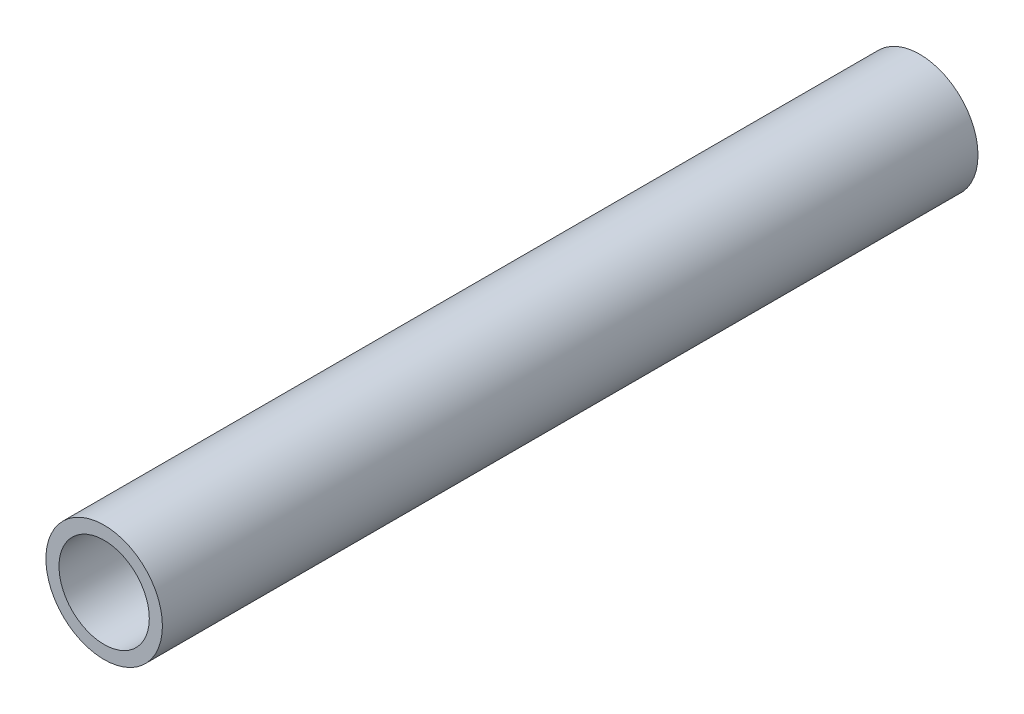
ISO-10303-21;
HEADER;
FILE_DESCRIPTION(('STEP AP214'),'2;1');
FILE_NAME('part.step','',(''),(''),'','','');
FILE_SCHEMA(('AUTOMOTIVE_DESIGN { 1 0 10303 214 1 1 1 1 }'));
ENDSEC;
DATA;
#1=APPLICATION_CONTEXT('core data for automotive mechanical design processes');
#2=APPLICATION_PROTOCOL_DEFINITION('international standard','automotive_design',2000,#1);
#3=PRODUCT_CONTEXT('',#1,'mechanical');
#4=PRODUCT('Part','Part','',(#3));
#5=PRODUCT_RELATED_PRODUCT_CATEGORY('part','',(#4));
#6=PRODUCT_DEFINITION_FORMATION('','',#4);
#7=PRODUCT_DEFINITION_CONTEXT('part definition',#1,'design');
#8=PRODUCT_DEFINITION('design','',#6,#7);
#9=PRODUCT_DEFINITION_SHAPE('','',#8);
#10=(LENGTH_UNIT() NAMED_UNIT(*) SI_UNIT(.MILLI.,.METRE.));
#11=(NAMED_UNIT(*) PLANE_ANGLE_UNIT() SI_UNIT($,.RADIAN.));
#12=(NAMED_UNIT(*) SI_UNIT($,.STERADIAN.) SOLID_ANGLE_UNIT());
#13=UNCERTAINTY_MEASURE_WITH_UNIT(LENGTH_MEASURE(1.E-05),#10,'distance_accuracy_value','');
#14=(GEOMETRIC_REPRESENTATION_CONTEXT(3) GLOBAL_UNCERTAINTY_ASSIGNED_CONTEXT((#13)) GLOBAL_UNIT_ASSIGNED_CONTEXT((#10,
#11,#12)) REPRESENTATION_CONTEXT('',''));
#15=CARTESIAN_POINT('',(0.,0.,0.));
#16=DIRECTION('',(0.,0.,1.));
#17=DIRECTION('',(1.,0.,0.));
#18=AXIS2_PLACEMENT_3D('',#15,#16,#17);
#19=CARTESIAN_POINT('',(0.,0.,14.));
#20=DIRECTION('',(0.,0.,1.));
#21=DIRECTION('',(1.,0.,0.));
#22=AXIS2_PLACEMENT_3D('',#19,#20,#21);
#23=PLANE('',#22);
#24=CARTESIAN_POINT('',(0.,0.,14.));
#25=DIRECTION('',(0.,0.,1.));
#26=DIRECTION('',(1.,0.,0.));
#27=AXIS2_PLACEMENT_3D('',#24,#25,#26);
#28=CIRCLE('',#27,1.);
#29=CARTESIAN_POINT('',(1.,0.,14.));
#30=VERTEX_POINT('',#29);
#31=EDGE_CURVE('E10',#30,#30,#28,.T.);
#32=ORIENTED_EDGE('',*,*,#31,.T.);
#33=EDGE_LOOP('',(#32));
#34=FACE_BOUND('',#33,.T.);
#35=CARTESIAN_POINT('',(0.,0.,14.));
#36=DIRECTION('',(0.,0.,1.));
#37=DIRECTION('',(1.,0.,0.));
#38=AXIS2_PLACEMENT_3D('',#35,#36,#37);
#39=CIRCLE('',#38,0.775);
#40=CARTESIAN_POINT('',(0.775,0.,14.));
#41=VERTEX_POINT('',#40);
#42=EDGE_CURVE('E46',#41,#41,#39,.T.);
#43=ORIENTED_EDGE('',*,*,#42,.F.);
#44=EDGE_LOOP('',(#43));
#45=FACE_BOUND('',#44,.T.);
#46=ADVANCED_FACE('F35',(#34,#45),#23,.T.);
#47=CARTESIAN_POINT('',(0.,0.,0.));
#48=DIRECTION('',(0.,0.,1.));
#49=DIRECTION('',(1.,0.,0.));
#50=AXIS2_PLACEMENT_3D('',#47,#48,#49);
#51=PLANE('',#50);
#52=CARTESIAN_POINT('',(0.,0.,0.));
#53=DIRECTION('',(0.,0.,1.));
#54=DIRECTION('',(1.,0.,0.));
#55=AXIS2_PLACEMENT_3D('',#52,#53,#54);
#56=CIRCLE('',#55,1.);
#57=CARTESIAN_POINT('',(1.,0.,0.));
#58=VERTEX_POINT('',#57);
#59=EDGE_CURVE('E39',#58,#58,#56,.T.);
#60=ORIENTED_EDGE('',*,*,#59,.F.);
#61=EDGE_LOOP('',(#60));
#62=FACE_BOUND('',#61,.T.);
#63=CARTESIAN_POINT('',(0.,0.,0.));
#64=DIRECTION('',(0.,0.,1.));
#65=DIRECTION('',(1.,0.,0.));
#66=AXIS2_PLACEMENT_3D('',#63,#64,#65);
#67=CIRCLE('',#66,0.775);
#68=CARTESIAN_POINT('',(0.775,0.,0.));
#69=VERTEX_POINT('',#68);
#70=EDGE_CURVE('E48',#69,#69,#67,.T.);
#71=ORIENTED_EDGE('',*,*,#70,.T.);
#72=EDGE_LOOP('',(#71));
#73=FACE_BOUND('',#72,.T.);
#74=ADVANCED_FACE('F58',(#62,#73),#51,.F.);
#75=CARTESIAN_POINT('',(0.,0.,14.));
#76=DIRECTION('',(0.,0.,-1.));
#77=DIRECTION('',(-1.,0.,0.));
#78=AXIS2_PLACEMENT_3D('',#75,#76,#77);
#79=CYLINDRICAL_SURFACE('',#78,1.);
#80=ORIENTED_EDGE('',*,*,#31,.F.);
#81=EDGE_LOOP('',(#80));
#82=FACE_BOUND('',#81,.T.);
#83=ORIENTED_EDGE('',*,*,#59,.T.);
#84=EDGE_LOOP('',(#83));
#85=FACE_BOUND('',#84,.T.);
#86=ADVANCED_FACE('F37',(#82,#85),#79,.T.);
#87=CARTESIAN_POINT('',(0.,0.,14.));
#88=DIRECTION('',(0.,0.,-1.));
#89=DIRECTION('',(-1.,0.,0.));
#90=AXIS2_PLACEMENT_3D('',#87,#88,#89);
#91=CYLINDRICAL_SURFACE('',#90,0.775);
#92=ORIENTED_EDGE('',*,*,#42,.T.);
#93=EDGE_LOOP('',(#92));
#94=FACE_BOUND('',#93,.T.);
#95=ORIENTED_EDGE('',*,*,#70,.F.);
#96=EDGE_LOOP('',(#95));
#97=FACE_BOUND('',#96,.T.);
#98=ADVANCED_FACE('F54',(#94,#97),#91,.F.);
#99=CLOSED_SHELL('',(#46,#74,#86,#98));
#100=MANIFOLD_SOLID_BREP('B2',#99);
#101=ADVANCED_BREP_SHAPE_REPRESENTATION('',(#18,#100),#14);
#102=SHAPE_DEFINITION_REPRESENTATION(#9,#101);
ENDSEC;
END-ISO-10303-21;
